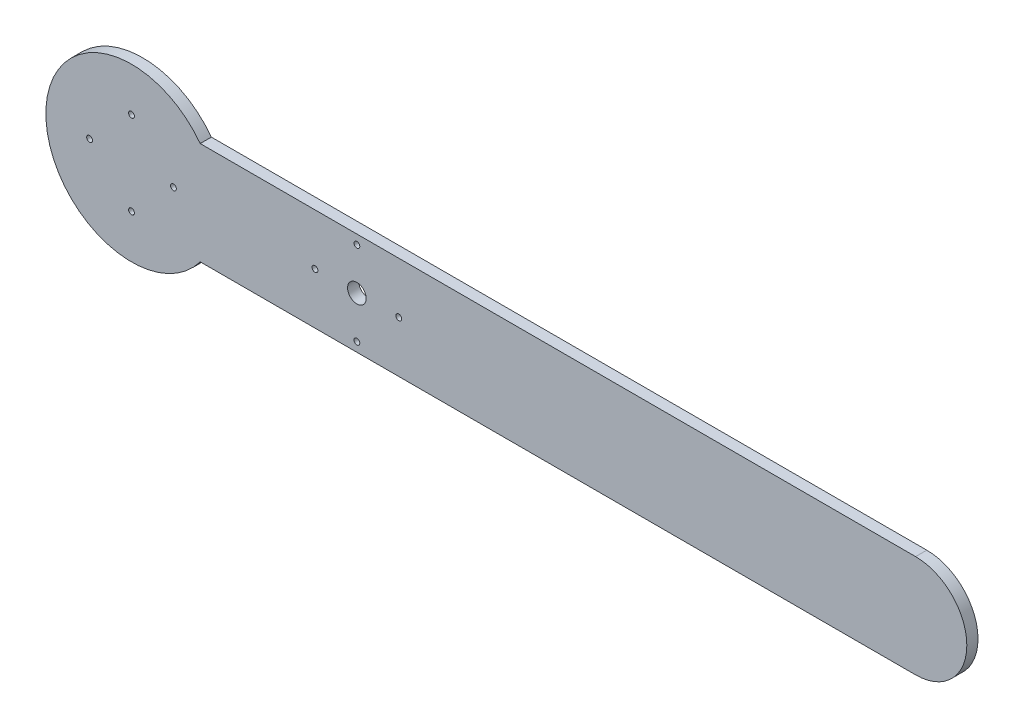
ISO-10303-21;
HEADER;
FILE_DESCRIPTION(('STEP AP214'),'2;1');
FILE_NAME('part.step','',(''),(''),'','','');
FILE_SCHEMA(('AUTOMOTIVE_DESIGN { 1 0 10303 214 1 1 1 1 }'));
ENDSEC;
DATA;
#1=APPLICATION_CONTEXT('core data for automotive mechanical design processes');
#2=APPLICATION_PROTOCOL_DEFINITION('international standard','automotive_design',2000,#1);
#3=PRODUCT_CONTEXT('',#1,'mechanical');
#4=PRODUCT('Part','Part','',(#3));
#5=PRODUCT_RELATED_PRODUCT_CATEGORY('part','',(#4));
#6=PRODUCT_DEFINITION_FORMATION('','',#4);
#7=PRODUCT_DEFINITION_CONTEXT('part definition',#1,'design');
#8=PRODUCT_DEFINITION('design','',#6,#7);
#9=PRODUCT_DEFINITION_SHAPE('','',#8);
#10=(LENGTH_UNIT() NAMED_UNIT(*) SI_UNIT(.MILLI.,.METRE.));
#11=(NAMED_UNIT(*) PLANE_ANGLE_UNIT() SI_UNIT($,.RADIAN.));
#12=(NAMED_UNIT(*) SI_UNIT($,.STERADIAN.) SOLID_ANGLE_UNIT());
#13=UNCERTAINTY_MEASURE_WITH_UNIT(LENGTH_MEASURE(1.E-05),#10,'distance_accuracy_value','');
#14=(GEOMETRIC_REPRESENTATION_CONTEXT(3) GLOBAL_UNCERTAINTY_ASSIGNED_CONTEXT((#13)) GLOBAL_UNIT_ASSIGNED_CONTEXT((#10,
#11,#12)) REPRESENTATION_CONTEXT('',''));
#15=CARTESIAN_POINT('',(0.,0.,0.));
#16=DIRECTION('',(0.,0.,1.));
#17=DIRECTION('',(1.,0.,0.));
#18=AXIS2_PLACEMENT_3D('',#15,#16,#17);
#19=CARTESIAN_POINT('',(300.,0.,62.6115));
#20=DIRECTION('',(0.,0.,-1.));
#21=DIRECTION('',(-1.,0.,0.));
#22=AXIS2_PLACEMENT_3D('',#19,#20,#21);
#23=PLANE('',#22);
#24=CARTESIAN_POINT('',(300.,0.,62.6115));
#25=DIRECTION('',(0.,0.,1.));
#26=DIRECTION('',(-1.,0.,0.));
#27=AXIS2_PLACEMENT_3D('',#24,#25,#26);
#28=CIRCLE('',#27,27.5);
#29=CARTESIAN_POINT('',(300.,-27.5,62.6115));
#30=VERTEX_POINT('',#29);
#31=CARTESIAN_POINT('',(300.,27.5,62.6115));
#32=VERTEX_POINT('',#31);
#33=EDGE_CURVE('E98',#30,#32,#28,.T.);
#34=ORIENTED_EDGE('',*,*,#33,.T.);
#35=DIRECTION('',(-1.,0.,0.));
#36=VECTOR('',#35,1.);
#37=CARTESIAN_POINT('',(300.,27.5,62.6115));
#38=LINE('',#37,#36);
#39=CARTESIAN_POINT('',(-84.1252118650153,27.5,62.6115));
#40=VERTEX_POINT('',#39);
#41=EDGE_CURVE('E93',#32,#40,#38,.T.);
#42=ORIENTED_EDGE('',*,*,#41,.T.);
#43=CARTESIAN_POINT('',(-121.,0.,62.6115));
#44=DIRECTION('',(0.,0.,1.));
#45=DIRECTION('',(1.,0.,0.));
#46=AXIS2_PLACEMENT_3D('',#43,#44,#45);
#47=CIRCLE('',#46,46.);
#48=CARTESIAN_POINT('',(-84.1252118650153,-27.5,62.6115));
#49=VERTEX_POINT('',#48);
#50=EDGE_CURVE('E96',#40,#49,#47,.T.);
#51=ORIENTED_EDGE('',*,*,#50,.T.);
#52=DIRECTION('',(1.,0.,0.));
#53=VECTOR('',#52,1.);
#54=CARTESIAN_POINT('',(-84.1252118650153,-27.5,62.6115));
#55=LINE('',#54,#53);
#56=EDGE_CURVE('E63',#49,#30,#55,.T.);
#57=ORIENTED_EDGE('',*,*,#56,.T.);
#58=EDGE_LOOP('',(#34,#42,#51,#57));
#59=FACE_BOUND('',#58,.T.);
#60=CARTESIAN_POINT('',(0.,22.5,62.6115));
#61=DIRECTION('',(0.,0.,1.));
#62=DIRECTION('',(1.,0.,0.));
#63=AXIS2_PLACEMENT_3D('',#60,#61,#62);
#64=CIRCLE('',#63,1.56350000000001);
#65=CARTESIAN_POINT('',(1.5635,22.5,62.6115));
#66=VERTEX_POINT('',#65);
#67=EDGE_CURVE('E118',#66,#66,#64,.T.);
#68=ORIENTED_EDGE('',*,*,#67,.F.);
#69=EDGE_LOOP('',(#68));
#70=FACE_BOUND('',#69,.T.);
#71=CARTESIAN_POINT('',(22.5,0.,62.6115));
#72=DIRECTION('',(0.,0.,1.));
#73=DIRECTION('',(1.,0.,0.));
#74=AXIS2_PLACEMENT_3D('',#71,#72,#73);
#75=CIRCLE('',#74,1.5635);
#76=CARTESIAN_POINT('',(24.0635,0.,62.6115));
#77=VERTEX_POINT('',#76);
#78=EDGE_CURVE('E140',#77,#77,#75,.T.);
#79=ORIENTED_EDGE('',*,*,#78,.F.);
#80=EDGE_LOOP('',(#79));
#81=FACE_BOUND('',#80,.T.);
#82=CARTESIAN_POINT('',(0.,-22.5000000000001,62.6115));
#83=DIRECTION('',(0.,0.,1.));
#84=DIRECTION('',(1.,0.,0.));
#85=AXIS2_PLACEMENT_3D('',#82,#83,#84);
#86=CIRCLE('',#85,1.5635);
#87=CARTESIAN_POINT('',(1.56349999999992,-22.5000000000001,62.6115));
#88=VERTEX_POINT('',#87);
#89=EDGE_CURVE('E148',#88,#88,#86,.T.);
#90=ORIENTED_EDGE('',*,*,#89,.F.);
#91=EDGE_LOOP('',(#90));
#92=FACE_BOUND('',#91,.T.);
#93=CARTESIAN_POINT('',(-22.5000000000001,0.,62.6115));
#94=DIRECTION('',(0.,0.,1.));
#95=DIRECTION('',(1.,0.,0.));
#96=AXIS2_PLACEMENT_3D('',#93,#94,#95);
#97=CIRCLE('',#96,1.5635);
#98=CARTESIAN_POINT('',(-20.9365000000001,0.,62.6115));
#99=VERTEX_POINT('',#98);
#100=EDGE_CURVE('E156',#99,#99,#97,.T.);
#101=ORIENTED_EDGE('',*,*,#100,.F.);
#102=EDGE_LOOP('',(#101));
#103=FACE_BOUND('',#102,.T.);
#104=CARTESIAN_POINT('',(0.,0.,62.6115));
#105=DIRECTION('',(0.,0.,1.));
#106=DIRECTION('',(1.,0.,0.));
#107=AXIS2_PLACEMENT_3D('',#104,#105,#106);
#108=CIRCLE('',#107,5.);
#109=CARTESIAN_POINT('',(4.99999999999999,0.,62.6115));
#110=VERTEX_POINT('',#109);
#111=EDGE_CURVE('E164',#110,#110,#108,.T.);
#112=ORIENTED_EDGE('',*,*,#111,.F.);
#113=EDGE_LOOP('',(#112));
#114=FACE_BOUND('',#113,.T.);
#115=CARTESIAN_POINT('',(-121.,-22.5,62.6115));
#116=DIRECTION('',(0.,0.,1.));
#117=DIRECTION('',(1.,0.,0.));
#118=AXIS2_PLACEMENT_3D('',#115,#116,#117);
#119=CIRCLE('',#118,1.56350000000001);
#120=CARTESIAN_POINT('',(-119.4365,-22.5,62.6115));
#121=VERTEX_POINT('',#120);
#122=EDGE_CURVE('E172',#121,#121,#119,.T.);
#123=ORIENTED_EDGE('',*,*,#122,.F.);
#124=EDGE_LOOP('',(#123));
#125=FACE_BOUND('',#124,.T.);
#126=CARTESIAN_POINT('',(-143.5,0.,62.6115));
#127=DIRECTION('',(0.,0.,1.));
#128=DIRECTION('',(1.,0.,0.));
#129=AXIS2_PLACEMENT_3D('',#126,#127,#128);
#130=CIRCLE('',#129,1.5635);
#131=CARTESIAN_POINT('',(-141.9365,0.,62.6115));
#132=VERTEX_POINT('',#131);
#133=EDGE_CURVE('E180',#132,#132,#130,.T.);
#134=ORIENTED_EDGE('',*,*,#133,.F.);
#135=EDGE_LOOP('',(#134));
#136=FACE_BOUND('',#135,.T.);
#137=CARTESIAN_POINT('',(-121.,22.5,62.6115));
#138=DIRECTION('',(0.,0.,1.));
#139=DIRECTION('',(1.,0.,0.));
#140=AXIS2_PLACEMENT_3D('',#137,#138,#139);
#141=CIRCLE('',#140,1.56350000000001);
#142=CARTESIAN_POINT('',(-119.4365,22.5,62.6115));
#143=VERTEX_POINT('',#142);
#144=EDGE_CURVE('E188',#143,#143,#141,.T.);
#145=ORIENTED_EDGE('',*,*,#144,.F.);
#146=EDGE_LOOP('',(#145));
#147=FACE_BOUND('',#146,.T.);
#148=CARTESIAN_POINT('',(-98.4999999999999,0.,62.6115));
#149=DIRECTION('',(0.,0.,1.));
#150=DIRECTION('',(1.,0.,0.));
#151=AXIS2_PLACEMENT_3D('',#148,#149,#150);
#152=CIRCLE('',#151,1.5635);
#153=CARTESIAN_POINT('',(-96.9364999999999,0.,62.6115));
#154=VERTEX_POINT('',#153);
#155=EDGE_CURVE('E196',#154,#154,#152,.T.);
#156=ORIENTED_EDGE('',*,*,#155,.F.);
#157=EDGE_LOOP('',(#156));
#158=FACE_BOUND('',#157,.T.);
#159=ADVANCED_FACE('F45',(#59,#70,#81,#92,#103,#114,#125,#136,#147,#158),#23,.F.);
#160=CARTESIAN_POINT('',(300.,0.,56.6115));
#161=DIRECTION('',(0.,0.,-1.));
#162=DIRECTION('',(-1.,0.,0.));
#163=AXIS2_PLACEMENT_3D('',#160,#161,#162);
#164=PLANE('',#163);
#165=CARTESIAN_POINT('',(-121.,22.5,56.6115));
#166=DIRECTION('',(0.,0.,1.));
#167=DIRECTION('',(1.,0.,0.));
#168=AXIS2_PLACEMENT_3D('',#165,#166,#167);
#169=CIRCLE('',#168,1.56350000000001);
#170=CARTESIAN_POINT('',(-119.4365,22.5,56.6115));
#171=VERTEX_POINT('',#170);
#172=EDGE_CURVE('E192',#171,#171,#169,.T.);
#173=ORIENTED_EDGE('',*,*,#172,.T.);
#174=EDGE_LOOP('',(#173));
#175=FACE_BOUND('',#174,.T.);
#176=CARTESIAN_POINT('',(-121.,-22.5,56.6115));
#177=DIRECTION('',(0.,0.,1.));
#178=DIRECTION('',(1.,0.,0.));
#179=AXIS2_PLACEMENT_3D('',#176,#177,#178);
#180=CIRCLE('',#179,1.56350000000001);
#181=CARTESIAN_POINT('',(-119.4365,-22.5,56.6115));
#182=VERTEX_POINT('',#181);
#183=EDGE_CURVE('E176',#182,#182,#180,.T.);
#184=ORIENTED_EDGE('',*,*,#183,.T.);
#185=EDGE_LOOP('',(#184));
#186=FACE_BOUND('',#185,.T.);
#187=CARTESIAN_POINT('',(-22.5000000000001,0.,56.6115));
#188=DIRECTION('',(0.,0.,1.));
#189=DIRECTION('',(1.,0.,0.));
#190=AXIS2_PLACEMENT_3D('',#187,#188,#189);
#191=CIRCLE('',#190,1.5635);
#192=CARTESIAN_POINT('',(-20.9365000000001,0.,56.6115));
#193=VERTEX_POINT('',#192);
#194=EDGE_CURVE('E160',#193,#193,#191,.T.);
#195=ORIENTED_EDGE('',*,*,#194,.T.);
#196=EDGE_LOOP('',(#195));
#197=FACE_BOUND('',#196,.T.);
#198=CARTESIAN_POINT('',(22.5,0.,56.6115));
#199=DIRECTION('',(0.,0.,1.));
#200=DIRECTION('',(1.,0.,0.));
#201=AXIS2_PLACEMENT_3D('',#198,#199,#200);
#202=CIRCLE('',#201,1.5635);
#203=CARTESIAN_POINT('',(24.0635,0.,56.6115));
#204=VERTEX_POINT('',#203);
#205=EDGE_CURVE('E144',#204,#204,#202,.T.);
#206=ORIENTED_EDGE('',*,*,#205,.T.);
#207=EDGE_LOOP('',(#206));
#208=FACE_BOUND('',#207,.T.);
#209=CARTESIAN_POINT('',(300.,0.,56.6115));
#210=DIRECTION('',(0.,0.,1.));
#211=DIRECTION('',(-1.,0.,0.));
#212=AXIS2_PLACEMENT_3D('',#209,#210,#211);
#213=CIRCLE('',#212,27.5);
#214=CARTESIAN_POINT('',(300.,-27.5,56.6115));
#215=VERTEX_POINT('',#214);
#216=CARTESIAN_POINT('',(300.,27.5,56.6115));
#217=VERTEX_POINT('',#216);
#218=EDGE_CURVE('E114',#215,#217,#213,.T.);
#219=ORIENTED_EDGE('',*,*,#218,.F.);
#220=DIRECTION('',(1.,0.,0.));
#221=VECTOR('',#220,1.);
#222=CARTESIAN_POINT('',(-84.1252118650153,-27.5,56.6115));
#223=LINE('',#222,#221);
#224=CARTESIAN_POINT('',(-84.1252118650153,-27.5,56.6115));
#225=VERTEX_POINT('',#224);
#226=EDGE_CURVE('E86',#225,#215,#223,.T.);
#227=ORIENTED_EDGE('',*,*,#226,.F.);
#228=CARTESIAN_POINT('',(-121.,0.,56.6115));
#229=DIRECTION('',(0.,0.,1.));
#230=DIRECTION('',(1.,0.,0.));
#231=AXIS2_PLACEMENT_3D('',#228,#229,#230);
#232=CIRCLE('',#231,46.);
#233=CARTESIAN_POINT('',(-84.1252118650153,27.5,56.6115));
#234=VERTEX_POINT('',#233);
#235=EDGE_CURVE('E80',#234,#225,#232,.T.);
#236=ORIENTED_EDGE('',*,*,#235,.F.);
#237=DIRECTION('',(-1.,0.,0.));
#238=VECTOR('',#237,1.);
#239=CARTESIAN_POINT('',(300.,27.5,56.6115));
#240=LINE('',#239,#238);
#241=EDGE_CURVE('E103',#217,#234,#240,.T.);
#242=ORIENTED_EDGE('',*,*,#241,.F.);
#243=EDGE_LOOP('',(#219,#227,#236,#242));
#244=FACE_BOUND('',#243,.T.);
#245=CARTESIAN_POINT('',(0.,22.5,56.6115));
#246=DIRECTION('',(0.,0.,1.));
#247=DIRECTION('',(1.,0.,0.));
#248=AXIS2_PLACEMENT_3D('',#245,#246,#247);
#249=CIRCLE('',#248,1.56350000000001);
#250=CARTESIAN_POINT('',(1.5635,22.5,56.6115));
#251=VERTEX_POINT('',#250);
#252=EDGE_CURVE('E136',#251,#251,#249,.T.);
#253=ORIENTED_EDGE('',*,*,#252,.T.);
#254=EDGE_LOOP('',(#253));
#255=FACE_BOUND('',#254,.T.);
#256=CARTESIAN_POINT('',(0.,-22.5000000000001,56.6115));
#257=DIRECTION('',(0.,0.,1.));
#258=DIRECTION('',(1.,0.,0.));
#259=AXIS2_PLACEMENT_3D('',#256,#257,#258);
#260=CIRCLE('',#259,1.5635);
#261=CARTESIAN_POINT('',(1.56349999999992,-22.5000000000001,56.6115));
#262=VERTEX_POINT('',#261);
#263=EDGE_CURVE('E152',#262,#262,#260,.T.);
#264=ORIENTED_EDGE('',*,*,#263,.T.);
#265=EDGE_LOOP('',(#264));
#266=FACE_BOUND('',#265,.T.);
#267=CARTESIAN_POINT('',(0.,0.,56.6115));
#268=DIRECTION('',(0.,0.,1.));
#269=DIRECTION('',(1.,0.,0.));
#270=AXIS2_PLACEMENT_3D('',#267,#268,#269);
#271=CIRCLE('',#270,5.);
#272=CARTESIAN_POINT('',(4.99999999999999,0.,56.6115));
#273=VERTEX_POINT('',#272);
#274=EDGE_CURVE('E168',#273,#273,#271,.T.);
#275=ORIENTED_EDGE('',*,*,#274,.T.);
#276=EDGE_LOOP('',(#275));
#277=FACE_BOUND('',#276,.T.);
#278=CARTESIAN_POINT('',(-143.5,0.,56.6115));
#279=DIRECTION('',(0.,0.,1.));
#280=DIRECTION('',(1.,0.,0.));
#281=AXIS2_PLACEMENT_3D('',#278,#279,#280);
#282=CIRCLE('',#281,1.5635);
#283=CARTESIAN_POINT('',(-141.9365,0.,56.6115));
#284=VERTEX_POINT('',#283);
#285=EDGE_CURVE('E184',#284,#284,#282,.T.);
#286=ORIENTED_EDGE('',*,*,#285,.T.);
#287=EDGE_LOOP('',(#286));
#288=FACE_BOUND('',#287,.T.);
#289=CARTESIAN_POINT('',(-98.4999999999999,0.,56.6115));
#290=DIRECTION('',(0.,0.,1.));
#291=DIRECTION('',(1.,0.,0.));
#292=AXIS2_PLACEMENT_3D('',#289,#290,#291);
#293=CIRCLE('',#292,1.5635);
#294=CARTESIAN_POINT('',(-96.9364999999999,0.,56.6115));
#295=VERTEX_POINT('',#294);
#296=EDGE_CURVE('E200',#295,#295,#293,.T.);
#297=ORIENTED_EDGE('',*,*,#296,.T.);
#298=EDGE_LOOP('',(#297));
#299=FACE_BOUND('',#298,.T.);
#300=ADVANCED_FACE('F131',(#175,#186,#197,#208,#244,#255,#266,#277,#288,#299),#164,.T.);
#301=CARTESIAN_POINT('',(300.,0.,62.6115));
#302=DIRECTION('',(0.,0.,-1.));
#303=DIRECTION('',(-1.,0.,0.));
#304=AXIS2_PLACEMENT_3D('',#301,#302,#303);
#305=CYLINDRICAL_SURFACE('',#304,27.5);
#306=ORIENTED_EDGE('',*,*,#218,.T.);
#307=DIRECTION('',(0.,0.,-1.));
#308=VECTOR('',#307,1.);
#309=CARTESIAN_POINT('',(300.,27.5,62.6115));
#310=LINE('',#309,#308);
#311=EDGE_CURVE('E11',#32,#217,#310,.T.);
#312=ORIENTED_EDGE('',*,*,#311,.F.);
#313=ORIENTED_EDGE('',*,*,#33,.F.);
#314=DIRECTION('',(0.,0.,-1.));
#315=VECTOR('',#314,1.);
#316=CARTESIAN_POINT('',(300.,-27.5,62.6115));
#317=LINE('',#316,#315);
#318=EDGE_CURVE('E110',#30,#215,#317,.T.);
#319=ORIENTED_EDGE('',*,*,#318,.T.);
#320=EDGE_LOOP('',(#306,#312,#313,#319));
#321=FACE_BOUND('',#320,.T.);
#322=ADVANCED_FACE('F47',(#321),#305,.T.);
#323=CARTESIAN_POINT('',(300.,27.5,62.6115));
#324=DIRECTION('',(0.,-1.,0.));
#325=DIRECTION('',(1.,0.,0.));
#326=AXIS2_PLACEMENT_3D('',#323,#324,#325);
#327=PLANE('',#326);
#328=ORIENTED_EDGE('',*,*,#241,.T.);
#329=DIRECTION('',(0.,0.,-1.));
#330=VECTOR('',#329,1.);
#331=CARTESIAN_POINT('',(-84.1252118650153,27.5,62.6115));
#332=LINE('',#331,#330);
#333=EDGE_CURVE('E55',#40,#234,#332,.T.);
#334=ORIENTED_EDGE('',*,*,#333,.F.);
#335=ORIENTED_EDGE('',*,*,#41,.F.);
#336=ORIENTED_EDGE('',*,*,#311,.T.);
#337=EDGE_LOOP('',(#328,#334,#335,#336));
#338=FACE_BOUND('',#337,.T.);
#339=ADVANCED_FACE('F102',(#338),#327,.F.);
#340=CARTESIAN_POINT('',(-121.,0.,62.6115));
#341=DIRECTION('',(0.,0.,-1.));
#342=DIRECTION('',(-1.,0.,0.));
#343=AXIS2_PLACEMENT_3D('',#340,#341,#342);
#344=CYLINDRICAL_SURFACE('',#343,46.);
#345=ORIENTED_EDGE('',*,*,#235,.T.);
#346=DIRECTION('',(0.,0.,-1.));
#347=VECTOR('',#346,1.);
#348=CARTESIAN_POINT('',(-84.1252118650153,-27.5,62.6115));
#349=LINE('',#348,#347);
#350=EDGE_CURVE('E105',#49,#225,#349,.T.);
#351=ORIENTED_EDGE('',*,*,#350,.F.);
#352=ORIENTED_EDGE('',*,*,#50,.F.);
#353=ORIENTED_EDGE('',*,*,#333,.T.);
#354=EDGE_LOOP('',(#345,#351,#352,#353));
#355=FACE_BOUND('',#354,.T.);
#356=ADVANCED_FACE('F106',(#355),#344,.T.);
#357=CARTESIAN_POINT('',(-84.1252118650153,-27.5,62.6115));
#358=DIRECTION('',(0.,1.,0.));
#359=DIRECTION('',(-1.,0.,0.));
#360=AXIS2_PLACEMENT_3D('',#357,#358,#359);
#361=PLANE('',#360);
#362=ORIENTED_EDGE('',*,*,#226,.T.);
#363=ORIENTED_EDGE('',*,*,#318,.F.);
#364=ORIENTED_EDGE('',*,*,#56,.F.);
#365=ORIENTED_EDGE('',*,*,#350,.T.);
#366=EDGE_LOOP('',(#362,#363,#364,#365));
#367=FACE_BOUND('',#366,.T.);
#368=ADVANCED_FACE('F128',(#367),#361,.F.);
#369=CARTESIAN_POINT('',(0.,22.5,62.6115));
#370=DIRECTION('',(0.,0.,-1.));
#371=DIRECTION('',(-1.,0.,0.));
#372=AXIS2_PLACEMENT_3D('',#369,#370,#371);
#373=CYLINDRICAL_SURFACE('',#372,1.56350000000001);
#374=ORIENTED_EDGE('',*,*,#67,.T.);
#375=EDGE_LOOP('',(#374));
#376=FACE_BOUND('',#375,.T.);
#377=ORIENTED_EDGE('',*,*,#252,.F.);
#378=EDGE_LOOP('',(#377));
#379=FACE_BOUND('',#378,.T.);
#380=ADVANCED_FACE('F219',(#376,#379),#373,.F.);
#381=CARTESIAN_POINT('',(22.5,0.,62.6115));
#382=DIRECTION('',(0.,0.,-1.));
#383=DIRECTION('',(-1.,0.,0.));
#384=AXIS2_PLACEMENT_3D('',#381,#382,#383);
#385=CYLINDRICAL_SURFACE('',#384,1.5635);
#386=ORIENTED_EDGE('',*,*,#78,.T.);
#387=EDGE_LOOP('',(#386));
#388=FACE_BOUND('',#387,.T.);
#389=ORIENTED_EDGE('',*,*,#205,.F.);
#390=EDGE_LOOP('',(#389));
#391=FACE_BOUND('',#390,.T.);
#392=ADVANCED_FACE('F264',(#388,#391),#385,.F.);
#393=CARTESIAN_POINT('',(0.,-22.5000000000001,62.6115));
#394=DIRECTION('',(0.,0.,-1.));
#395=DIRECTION('',(-1.,0.,0.));
#396=AXIS2_PLACEMENT_3D('',#393,#394,#395);
#397=CYLINDRICAL_SURFACE('',#396,1.5635);
#398=ORIENTED_EDGE('',*,*,#89,.T.);
#399=EDGE_LOOP('',(#398));
#400=FACE_BOUND('',#399,.T.);
#401=ORIENTED_EDGE('',*,*,#263,.F.);
#402=EDGE_LOOP('',(#401));
#403=FACE_BOUND('',#402,.T.);
#404=ADVANCED_FACE('F272',(#400,#403),#397,.F.);
#405=CARTESIAN_POINT('',(-22.5000000000001,0.,62.6115));
#406=DIRECTION('',(0.,0.,-1.));
#407=DIRECTION('',(-1.,0.,0.));
#408=AXIS2_PLACEMENT_3D('',#405,#406,#407);
#409=CYLINDRICAL_SURFACE('',#408,1.5635);
#410=ORIENTED_EDGE('',*,*,#100,.T.);
#411=EDGE_LOOP('',(#410));
#412=FACE_BOUND('',#411,.T.);
#413=ORIENTED_EDGE('',*,*,#194,.F.);
#414=EDGE_LOOP('',(#413));
#415=FACE_BOUND('',#414,.T.);
#416=ADVANCED_FACE('F280',(#412,#415),#409,.F.);
#417=CARTESIAN_POINT('',(0.,0.,62.6115));
#418=DIRECTION('',(0.,0.,-1.));
#419=DIRECTION('',(-1.,0.,0.));
#420=AXIS2_PLACEMENT_3D('',#417,#418,#419);
#421=CYLINDRICAL_SURFACE('',#420,5.);
#422=ORIENTED_EDGE('',*,*,#111,.T.);
#423=EDGE_LOOP('',(#422));
#424=FACE_BOUND('',#423,.T.);
#425=ORIENTED_EDGE('',*,*,#274,.F.);
#426=EDGE_LOOP('',(#425));
#427=FACE_BOUND('',#426,.T.);
#428=ADVANCED_FACE('F289',(#424,#427),#421,.F.);
#429=CARTESIAN_POINT('',(-121.,-22.5,62.6115));
#430=DIRECTION('',(0.,0.,-1.));
#431=DIRECTION('',(-1.,0.,0.));
#432=AXIS2_PLACEMENT_3D('',#429,#430,#431);
#433=CYLINDRICAL_SURFACE('',#432,1.56350000000001);
#434=ORIENTED_EDGE('',*,*,#122,.T.);
#435=EDGE_LOOP('',(#434));
#436=FACE_BOUND('',#435,.T.);
#437=ORIENTED_EDGE('',*,*,#183,.F.);
#438=EDGE_LOOP('',(#437));
#439=FACE_BOUND('',#438,.T.);
#440=ADVANCED_FACE('F298',(#436,#439),#433,.F.);
#441=CARTESIAN_POINT('',(-143.5,0.,62.6115));
#442=DIRECTION('',(0.,0.,-1.));
#443=DIRECTION('',(-1.,0.,0.));
#444=AXIS2_PLACEMENT_3D('',#441,#442,#443);
#445=CYLINDRICAL_SURFACE('',#444,1.5635);
#446=ORIENTED_EDGE('',*,*,#133,.T.);
#447=EDGE_LOOP('',(#446));
#448=FACE_BOUND('',#447,.T.);
#449=ORIENTED_EDGE('',*,*,#285,.F.);
#450=EDGE_LOOP('',(#449));
#451=FACE_BOUND('',#450,.T.);
#452=ADVANCED_FACE('F307',(#448,#451),#445,.F.);
#453=CARTESIAN_POINT('',(-121.,22.5,62.6115));
#454=DIRECTION('',(0.,0.,-1.));
#455=DIRECTION('',(-1.,0.,0.));
#456=AXIS2_PLACEMENT_3D('',#453,#454,#455);
#457=CYLINDRICAL_SURFACE('',#456,1.56350000000001);
#458=ORIENTED_EDGE('',*,*,#144,.T.);
#459=EDGE_LOOP('',(#458));
#460=FACE_BOUND('',#459,.T.);
#461=ORIENTED_EDGE('',*,*,#172,.F.);
#462=EDGE_LOOP('',(#461));
#463=FACE_BOUND('',#462,.T.);
#464=ADVANCED_FACE('F316',(#460,#463),#457,.F.);
#465=CARTESIAN_POINT('',(-98.4999999999999,0.,62.6115));
#466=DIRECTION('',(0.,0.,-1.));
#467=DIRECTION('',(-1.,0.,0.));
#468=AXIS2_PLACEMENT_3D('',#465,#466,#467);
#469=CYLINDRICAL_SURFACE('',#468,1.5635);
#470=ORIENTED_EDGE('',*,*,#155,.T.);
#471=EDGE_LOOP('',(#470));
#472=FACE_BOUND('',#471,.T.);
#473=ORIENTED_EDGE('',*,*,#296,.F.);
#474=EDGE_LOOP('',(#473));
#475=FACE_BOUND('',#474,.T.);
#476=ADVANCED_FACE('F208',(#472,#475),#469,.F.);
#477=CLOSED_SHELL('',(#159,#300,#322,#339,#356,#368,#380,#392,#404,#416,#428,#440,#452,#464,#476));
#478=MANIFOLD_SOLID_BREP('B2',#477);
#479=ADVANCED_BREP_SHAPE_REPRESENTATION('',(#18,#478),#14);
#480=SHAPE_DEFINITION_REPRESENTATION(#9,#479);
ENDSEC;
END-ISO-10303-21;
